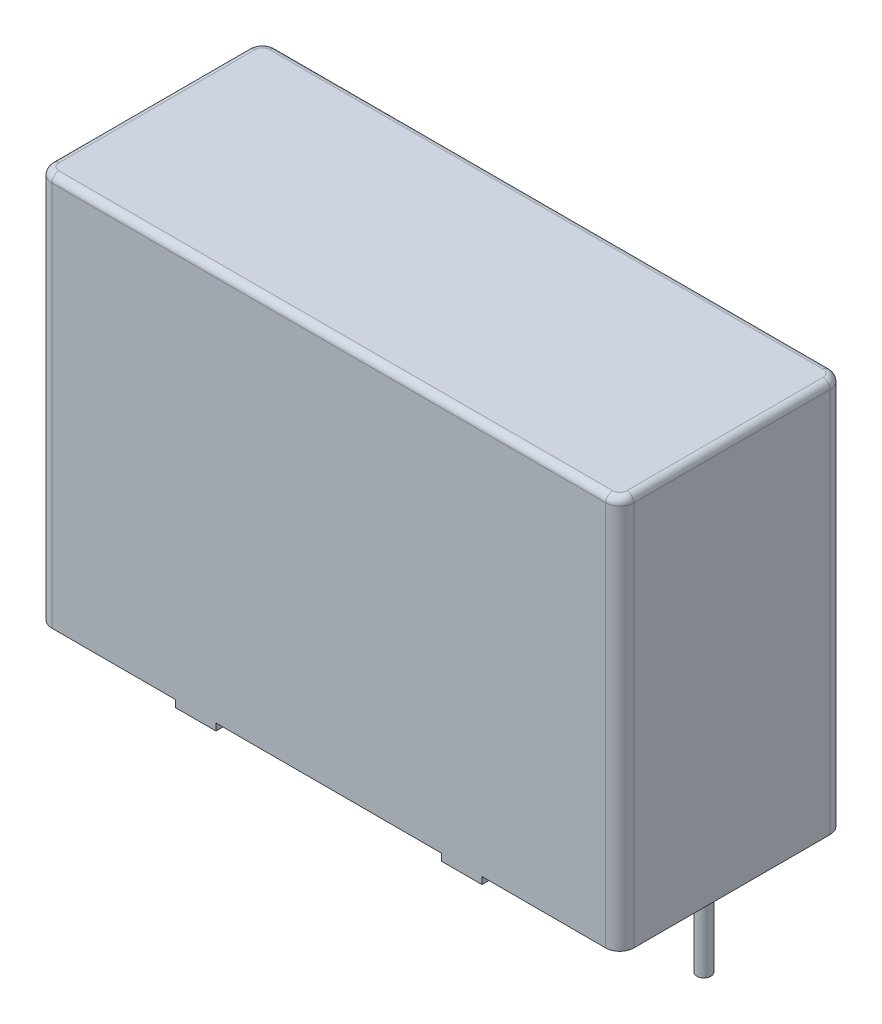
ISO-10303-21;
HEADER;
FILE_DESCRIPTION(('STEP AP214'),'2;1');
FILE_NAME('part.step','',(''),(''),'','','');
FILE_SCHEMA(('AUTOMOTIVE_DESIGN { 1 0 10303 214 1 1 1 1 }'));
ENDSEC;
DATA;
#1=APPLICATION_CONTEXT('core data for automotive mechanical design processes');
#2=APPLICATION_PROTOCOL_DEFINITION('international standard','automotive_design',2000,#1);
#3=PRODUCT_CONTEXT('',#1,'mechanical');
#4=PRODUCT('Part','Part','',(#3));
#5=PRODUCT_RELATED_PRODUCT_CATEGORY('part','',(#4));
#6=PRODUCT_DEFINITION_FORMATION('','',#4);
#7=PRODUCT_DEFINITION_CONTEXT('part definition',#1,'design');
#8=PRODUCT_DEFINITION('design','',#6,#7);
#9=PRODUCT_DEFINITION_SHAPE('','',#8);
#10=(LENGTH_UNIT() NAMED_UNIT(*) SI_UNIT(.MILLI.,.METRE.));
#11=(NAMED_UNIT(*) PLANE_ANGLE_UNIT() SI_UNIT($,.RADIAN.));
#12=(NAMED_UNIT(*) SI_UNIT($,.STERADIAN.) SOLID_ANGLE_UNIT());
#13=UNCERTAINTY_MEASURE_WITH_UNIT(LENGTH_MEASURE(1.E-05),#10,'distance_accuracy_value','');
#14=(GEOMETRIC_REPRESENTATION_CONTEXT(3) GLOBAL_UNCERTAINTY_ASSIGNED_CONTEXT((#13)) GLOBAL_UNIT_ASSIGNED_CONTEXT((#10,
#11,#12)) REPRESENTATION_CONTEXT('',''));
#15=CARTESIAN_POINT('',(0.,0.,0.));
#16=DIRECTION('',(0.,0.,1.));
#17=DIRECTION('',(1.,0.,0.));
#18=AXIS2_PLACEMENT_3D('',#15,#16,#17);
#19=CARTESIAN_POINT('',(20.75,28.5,8.));
#20=DIRECTION('',(-1.,0.,0.));
#21=DIRECTION('',(0.,0.,1.));
#22=AXIS2_PLACEMENT_3D('',#19,#20,#21);
#23=PLANE('',#22);
#24=DIRECTION('',(0.,0.,1.));
#25=VECTOR('',#24,1.);
#26=CARTESIAN_POINT('',(20.75,0.5,0.));
#27=LINE('',#26,#25);
#28=CARTESIAN_POINT('',(20.75,0.5,-7.));
#29=VERTEX_POINT('',#28);
#30=CARTESIAN_POINT('',(20.75,0.5,7.));
#31=VERTEX_POINT('',#30);
#32=EDGE_CURVE('E270',#29,#31,#27,.T.);
#33=ORIENTED_EDGE('',*,*,#32,.F.);
#34=DIRECTION('',(0.,-1.,0.));
#35=VECTOR('',#34,1.);
#36=CARTESIAN_POINT('',(20.75,28.5,-7.));
#37=LINE('',#36,#35);
#38=CARTESIAN_POINT('',(20.75,28.,-7.));
#39=VERTEX_POINT('',#38);
#40=EDGE_CURVE('E60',#29,#39,#37,.F.);
#41=ORIENTED_EDGE('',*,*,#40,.T.);
#42=DIRECTION('',(0.,0.,-1.));
#43=VECTOR('',#42,1.);
#44=CARTESIAN_POINT('',(20.75,28.,8.));
#45=LINE('',#44,#43);
#46=CARTESIAN_POINT('',(20.75,28.,7.));
#47=VERTEX_POINT('',#46);
#48=EDGE_CURVE('E11',#39,#47,#45,.F.);
#49=ORIENTED_EDGE('',*,*,#48,.T.);
#50=DIRECTION('',(0.,-1.,0.));
#51=VECTOR('',#50,1.);
#52=CARTESIAN_POINT('',(20.75,28.5,7.));
#53=LINE('',#52,#51);
#54=EDGE_CURVE('E375',#47,#31,#53,.T.);
#55=ORIENTED_EDGE('',*,*,#54,.T.);
#56=EDGE_LOOP('',(#33,#41,#49,#55));
#57=FACE_BOUND('',#56,.T.);
#58=ADVANCED_FACE('F36',(#57),#23,.F.);
#59=CARTESIAN_POINT('',(-20.75,28.5,-8.));
#60=DIRECTION('',(0.,0.,1.));
#61=DIRECTION('',(1.,0.,0.));
#62=AXIS2_PLACEMENT_3D('',#59,#60,#61);
#63=PLANE('',#62);
#64=DIRECTION('',(-1.,0.,0.));
#65=VECTOR('',#64,1.);
#66=CARTESIAN_POINT('',(-20.75,0.,-8.));
#67=LINE('',#66,#65);
#68=CARTESIAN_POINT('',(-8.05079654813872,0.,-8.));
#69=VERTEX_POINT('',#68);
#70=CARTESIAN_POINT('',(-10.9201115808664,0.,-8.));
#71=VERTEX_POINT('',#70);
#72=EDGE_CURVE('E362',#69,#71,#67,.T.);
#73=ORIENTED_EDGE('',*,*,#72,.T.);
#74=DIRECTION('',(0.,-1.,0.));
#75=VECTOR('',#74,1.);
#76=CARTESIAN_POINT('',(-10.9201115808664,0.5,-8.));
#77=LINE('',#76,#75);
#78=CARTESIAN_POINT('',(-10.9201115808664,0.5,-8.));
#79=VERTEX_POINT('',#78);
#80=EDGE_CURVE('E328',#79,#71,#77,.T.);
#81=ORIENTED_EDGE('',*,*,#80,.F.);
#82=DIRECTION('',(1.,0.,0.));
#83=VECTOR('',#82,1.);
#84=CARTESIAN_POINT('',(0.,0.5,-8.));
#85=LINE('',#84,#83);
#86=CARTESIAN_POINT('',(-19.75,0.5,-8.));
#87=VERTEX_POINT('',#86);
#88=EDGE_CURVE('E235',#87,#79,#85,.T.);
#89=ORIENTED_EDGE('',*,*,#88,.F.);
#90=DIRECTION('',(0.,-1.,0.));
#91=VECTOR('',#90,1.);
#92=CARTESIAN_POINT('',(-19.75,28.5,-8.));
#93=LINE('',#92,#91);
#94=CARTESIAN_POINT('',(-19.75,28.,-8.));
#95=VERTEX_POINT('',#94);
#96=EDGE_CURVE('E370',#87,#95,#93,.F.);
#97=ORIENTED_EDGE('',*,*,#96,.T.);
#98=DIRECTION('',(-1.,0.,0.));
#99=VECTOR('',#98,1.);
#100=CARTESIAN_POINT('',(-20.75,28.,-8.));
#101=LINE('',#100,#99);
#102=CARTESIAN_POINT('',(19.75,28.,-8.));
#103=VERTEX_POINT('',#102);
#104=EDGE_CURVE('E419',#95,#103,#101,.F.);
#105=ORIENTED_EDGE('',*,*,#104,.T.);
#106=DIRECTION('',(0.,-1.,0.));
#107=VECTOR('',#106,1.);
#108=CARTESIAN_POINT('',(19.75,28.5,-8.));
#109=LINE('',#108,#107);
#110=CARTESIAN_POINT('',(19.75,0.5,-8.));
#111=VERTEX_POINT('',#110);
#112=EDGE_CURVE('E372',#103,#111,#109,.T.);
#113=ORIENTED_EDGE('',*,*,#112,.T.);
#114=DIRECTION('',(1.,0.,0.));
#115=VECTOR('',#114,1.);
#116=CARTESIAN_POINT('',(0.,0.5,-8.));
#117=LINE('',#116,#115);
#118=CARTESIAN_POINT('',(10.9201115808664,0.5,-8.));
#119=VERTEX_POINT('',#118);
#120=EDGE_CURVE('E266',#119,#111,#117,.T.);
#121=ORIENTED_EDGE('',*,*,#120,.F.);
#122=DIRECTION('',(0.,-1.,0.));
#123=VECTOR('',#122,1.);
#124=CARTESIAN_POINT('',(10.9201115808664,0.5,-8.));
#125=LINE('',#124,#123);
#126=CARTESIAN_POINT('',(10.9201115808664,0.,-8.));
#127=VERTEX_POINT('',#126);
#128=EDGE_CURVE('E349',#119,#127,#125,.T.);
#129=ORIENTED_EDGE('',*,*,#128,.T.);
#130=CARTESIAN_POINT('',(8.05079654813871,0.,-8.));
#131=VERTEX_POINT('',#130);
#132=EDGE_CURVE('E365',#127,#131,#67,.T.);
#133=ORIENTED_EDGE('',*,*,#132,.T.);
#134=DIRECTION('',(0.,-1.,0.));
#135=VECTOR('',#134,1.);
#136=CARTESIAN_POINT('',(8.05079654813871,0.5,-8.));
#137=LINE('',#136,#135);
#138=CARTESIAN_POINT('',(8.05079654813871,0.5,-8.));
#139=VERTEX_POINT('',#138);
#140=EDGE_CURVE('E356',#139,#131,#137,.T.);
#141=ORIENTED_EDGE('',*,*,#140,.F.);
#142=DIRECTION('',(1.,0.,0.));
#143=VECTOR('',#142,1.);
#144=CARTESIAN_POINT('',(0.,0.5,-8.));
#145=LINE('',#144,#143);
#146=CARTESIAN_POINT('',(-8.05079654813872,0.5,-8.));
#147=VERTEX_POINT('',#146);
#148=EDGE_CURVE('E258',#147,#139,#145,.T.);
#149=ORIENTED_EDGE('',*,*,#148,.F.);
#150=DIRECTION('',(0.,-1.,0.));
#151=VECTOR('',#150,1.);
#152=CARTESIAN_POINT('',(-8.05079654813872,0.5,-8.));
#153=LINE('',#152,#151);
#154=EDGE_CURVE('E358',#147,#69,#153,.T.);
#155=ORIENTED_EDGE('',*,*,#154,.T.);
#156=EDGE_LOOP('',(#73,#81,#89,#97,#105,#113,#121,#129,#133,#141,#149,#155));
#157=FACE_BOUND('',#156,.T.);
#158=ADVANCED_FACE('F492',(#157),#63,.F.);
#159=CARTESIAN_POINT('',(-20.75,28.5,8.));
#160=DIRECTION('',(1.,0.,0.));
#161=DIRECTION('',(0.,0.,-1.));
#162=AXIS2_PLACEMENT_3D('',#159,#160,#161);
#163=PLANE('',#162);
#164=DIRECTION('',(0.,0.,-1.));
#165=VECTOR('',#164,1.);
#166=CARTESIAN_POINT('',(-20.75,0.5,0.));
#167=LINE('',#166,#165);
#168=CARTESIAN_POINT('',(-20.75,0.5,7.));
#169=VERTEX_POINT('',#168);
#170=CARTESIAN_POINT('',(-20.75,0.5,-7.));
#171=VERTEX_POINT('',#170);
#172=EDGE_CURVE('E297',#169,#171,#167,.T.);
#173=ORIENTED_EDGE('',*,*,#172,.F.);
#174=DIRECTION('',(0.,-1.,0.));
#175=VECTOR('',#174,1.);
#176=CARTESIAN_POINT('',(-20.75,28.5,7.));
#177=LINE('',#176,#175);
#178=CARTESIAN_POINT('',(-20.75,28.,7.));
#179=VERTEX_POINT('',#178);
#180=EDGE_CURVE('E384',#169,#179,#177,.F.);
#181=ORIENTED_EDGE('',*,*,#180,.T.);
#182=DIRECTION('',(0.,0.,1.));
#183=VECTOR('',#182,1.);
#184=CARTESIAN_POINT('',(-20.75,28.,8.));
#185=LINE('',#184,#183);
#186=CARTESIAN_POINT('',(-20.75,28.,-7.));
#187=VERTEX_POINT('',#186);
#188=EDGE_CURVE('E414',#179,#187,#185,.F.);
#189=ORIENTED_EDGE('',*,*,#188,.T.);
#190=DIRECTION('',(0.,-1.,0.));
#191=VECTOR('',#190,1.);
#192=CARTESIAN_POINT('',(-20.75,28.5,-7.));
#193=LINE('',#192,#191);
#194=EDGE_CURVE('E386',#187,#171,#193,.T.);
#195=ORIENTED_EDGE('',*,*,#194,.T.);
#196=EDGE_LOOP('',(#173,#181,#189,#195));
#197=FACE_BOUND('',#196,.T.);
#198=ADVANCED_FACE('F460',(#197),#163,.F.);
#199=CARTESIAN_POINT('',(-20.75,28.5,8.));
#200=DIRECTION('',(0.,0.,-1.));
#201=DIRECTION('',(-1.,0.,0.));
#202=AXIS2_PLACEMENT_3D('',#199,#200,#201);
#203=PLANE('',#202);
#204=DIRECTION('',(1.,0.,0.));
#205=VECTOR('',#204,1.);
#206=CARTESIAN_POINT('',(-20.75,0.,8.));
#207=LINE('',#206,#205);
#208=CARTESIAN_POINT('',(8.05079654813872,0.,8.));
#209=VERTEX_POINT('',#208);
#210=CARTESIAN_POINT('',(10.9201115808664,0.,8.));
#211=VERTEX_POINT('',#210);
#212=EDGE_CURVE('E366',#209,#211,#207,.T.);
#213=ORIENTED_EDGE('',*,*,#212,.T.);
#214=DIRECTION('',(0.,-1.,0.));
#215=VECTOR('',#214,1.);
#216=CARTESIAN_POINT('',(10.9201115808664,0.5,8.));
#217=LINE('',#216,#215);
#218=CARTESIAN_POINT('',(10.9201115808664,0.5,8.));
#219=VERTEX_POINT('',#218);
#220=EDGE_CURVE('E347',#219,#211,#217,.T.);
#221=ORIENTED_EDGE('',*,*,#220,.F.);
#222=DIRECTION('',(-1.,0.,0.));
#223=VECTOR('',#222,1.);
#224=CARTESIAN_POINT('',(0.,0.5,8.));
#225=LINE('',#224,#223);
#226=CARTESIAN_POINT('',(19.75,0.5,8.));
#227=VERTEX_POINT('',#226);
#228=EDGE_CURVE('E274',#227,#219,#225,.T.);
#229=ORIENTED_EDGE('',*,*,#228,.F.);
#230=DIRECTION('',(0.,-1.,0.));
#231=VECTOR('',#230,1.);
#232=CARTESIAN_POINT('',(19.75,28.5,8.));
#233=LINE('',#232,#231);
#234=CARTESIAN_POINT('',(19.75,28.,8.));
#235=VERTEX_POINT('',#234);
#236=EDGE_CURVE('E382',#227,#235,#233,.F.);
#237=ORIENTED_EDGE('',*,*,#236,.T.);
#238=DIRECTION('',(1.,0.,0.));
#239=VECTOR('',#238,1.);
#240=CARTESIAN_POINT('',(-20.75,28.,8.));
#241=LINE('',#240,#239);
#242=CARTESIAN_POINT('',(-19.75,28.,8.));
#243=VERTEX_POINT('',#242);
#244=EDGE_CURVE('E409',#235,#243,#241,.F.);
#245=ORIENTED_EDGE('',*,*,#244,.T.);
#246=DIRECTION('',(0.,-1.,0.));
#247=VECTOR('',#246,1.);
#248=CARTESIAN_POINT('',(-19.75,28.5,8.));
#249=LINE('',#248,#247);
#250=CARTESIAN_POINT('',(-19.75,0.5,8.));
#251=VERTEX_POINT('',#250);
#252=EDGE_CURVE('E379',#243,#251,#249,.T.);
#253=ORIENTED_EDGE('',*,*,#252,.T.);
#254=DIRECTION('',(-1.,0.,0.));
#255=VECTOR('',#254,1.);
#256=CARTESIAN_POINT('',(0.,0.5,8.));
#257=LINE('',#256,#255);
#258=CARTESIAN_POINT('',(-10.9201115808664,0.5,8.));
#259=VERTEX_POINT('',#258);
#260=EDGE_CURVE('E53',#259,#251,#257,.T.);
#261=ORIENTED_EDGE('',*,*,#260,.F.);
#262=DIRECTION('',(0.,-1.,0.));
#263=VECTOR('',#262,1.);
#264=CARTESIAN_POINT('',(-10.9201115808664,0.5,8.));
#265=LINE('',#264,#263);
#266=CARTESIAN_POINT('',(-10.9201115808664,0.,8.));
#267=VERTEX_POINT('',#266);
#268=EDGE_CURVE('E331',#259,#267,#265,.T.);
#269=ORIENTED_EDGE('',*,*,#268,.T.);
#270=CARTESIAN_POINT('',(-8.05079654813871,0.,8.));
#271=VERTEX_POINT('',#270);
#272=EDGE_CURVE('E369',#267,#271,#207,.T.);
#273=ORIENTED_EDGE('',*,*,#272,.T.);
#274=DIRECTION('',(0.,-1.,0.));
#275=VECTOR('',#274,1.);
#276=CARTESIAN_POINT('',(-8.05079654813871,0.5,8.));
#277=LINE('',#276,#275);
#278=CARTESIAN_POINT('',(-8.05079654813871,0.5,8.));
#279=VERTEX_POINT('',#278);
#280=EDGE_CURVE('E338',#279,#271,#277,.T.);
#281=ORIENTED_EDGE('',*,*,#280,.F.);
#282=DIRECTION('',(-1.,0.,0.));
#283=VECTOR('',#282,1.);
#284=CARTESIAN_POINT('',(0.,0.5,8.));
#285=LINE('',#284,#283);
#286=CARTESIAN_POINT('',(8.05079654813872,0.5,8.));
#287=VERTEX_POINT('',#286);
#288=EDGE_CURVE('E286',#287,#279,#285,.T.);
#289=ORIENTED_EDGE('',*,*,#288,.F.);
#290=DIRECTION('',(0.,-1.,0.));
#291=VECTOR('',#290,1.);
#292=CARTESIAN_POINT('',(8.05079654813872,0.5,8.));
#293=LINE('',#292,#291);
#294=EDGE_CURVE('E340',#287,#209,#293,.T.);
#295=ORIENTED_EDGE('',*,*,#294,.T.);
#296=EDGE_LOOP('',(#213,#221,#229,#237,#245,#253,#261,#269,#273,#281,#289,#295));
#297=FACE_BOUND('',#296,.T.);
#298=ADVANCED_FACE('F562',(#297),#203,.F.);
#299=CARTESIAN_POINT('',(0.,0.,0.));
#300=DIRECTION('',(0.,-1.,0.));
#301=DIRECTION('',(0.,0.,-1.));
#302=AXIS2_PLACEMENT_3D('',#299,#300,#301);
#303=PLANE('',#302);
#304=ORIENTED_EDGE('',*,*,#272,.F.);
#305=DIRECTION('',(0.,0.,-1.));
#306=VECTOR('',#305,1.);
#307=CARTESIAN_POINT('',(-10.9201115808663,0.,0.));
#308=LINE('',#307,#306);
#309=CARTESIAN_POINT('',(-10.9201115808664,0.,7.5));
#310=VERTEX_POINT('',#309);
#311=EDGE_CURVE('E248',#267,#310,#308,.T.);
#312=ORIENTED_EDGE('',*,*,#311,.T.);
#313=DIRECTION('',(-1.,0.,0.));
#314=VECTOR('',#313,1.);
#315=CARTESIAN_POINT('',(0.,0.,7.5));
#316=LINE('',#315,#314);
#317=CARTESIAN_POINT('',(-8.05079654813872,0.,7.5));
#318=VERTEX_POINT('',#317);
#319=EDGE_CURVE('E251',#318,#310,#316,.T.);
#320=ORIENTED_EDGE('',*,*,#319,.F.);
#321=DIRECTION('',(0.,0.,-1.));
#322=VECTOR('',#321,1.);
#323=CARTESIAN_POINT('',(-8.05079654813874,0.,0.));
#324=LINE('',#323,#322);
#325=EDGE_CURVE('E325',#271,#318,#324,.T.);
#326=ORIENTED_EDGE('',*,*,#325,.F.);
#327=EDGE_LOOP('',(#304,#312,#320,#326));
#328=FACE_BOUND('',#327,.T.);
#329=ADVANCED_FACE('F558',(#328),#303,.T.);
#330=ORIENTED_EDGE('',*,*,#212,.F.);
#331=DIRECTION('',(0.,0.,-1.));
#332=VECTOR('',#331,1.);
#333=CARTESIAN_POINT('',(8.05079654813874,0.,0.));
#334=LINE('',#333,#332);
#335=CARTESIAN_POINT('',(8.05079654813872,0.,7.5));
#336=VERTEX_POINT('',#335);
#337=EDGE_CURVE('E322',#209,#336,#334,.T.);
#338=ORIENTED_EDGE('',*,*,#337,.T.);
#339=CARTESIAN_POINT('',(10.9201115808664,0.,7.5));
#340=VERTEX_POINT('',#339);
#341=EDGE_CURVE('E319',#340,#336,#316,.T.);
#342=ORIENTED_EDGE('',*,*,#341,.F.);
#343=DIRECTION('',(0.,0.,-1.));
#344=VECTOR('',#343,1.);
#345=CARTESIAN_POINT('',(10.9201115808663,0.,0.));
#346=LINE('',#345,#344);
#347=EDGE_CURVE('E316',#211,#340,#346,.T.);
#348=ORIENTED_EDGE('',*,*,#347,.F.);
#349=EDGE_LOOP('',(#330,#338,#342,#348));
#350=FACE_BOUND('',#349,.T.);
#351=ADVANCED_FACE('F580',(#350),#303,.T.);
#352=ORIENTED_EDGE('',*,*,#132,.F.);
#353=DIRECTION('',(0.,0.,1.));
#354=VECTOR('',#353,1.);
#355=CARTESIAN_POINT('',(10.9201115808663,0.,0.));
#356=LINE('',#355,#354);
#357=CARTESIAN_POINT('',(10.9201115808664,0.,-7.5));
#358=VERTEX_POINT('',#357);
#359=EDGE_CURVE('E313',#127,#358,#356,.T.);
#360=ORIENTED_EDGE('',*,*,#359,.T.);
#361=DIRECTION('',(1.,0.,0.));
#362=VECTOR('',#361,1.);
#363=CARTESIAN_POINT('',(0.,0.,-7.5));
#364=LINE('',#363,#362);
#365=CARTESIAN_POINT('',(8.05079654813872,0.,-7.5));
#366=VERTEX_POINT('',#365);
#367=EDGE_CURVE('E307',#366,#358,#364,.T.);
#368=ORIENTED_EDGE('',*,*,#367,.F.);
#369=DIRECTION('',(0.,0.,1.));
#370=VECTOR('',#369,1.);
#371=CARTESIAN_POINT('',(8.05079654813874,0.,0.));
#372=LINE('',#371,#370);
#373=EDGE_CURVE('E310',#131,#366,#372,.T.);
#374=ORIENTED_EDGE('',*,*,#373,.F.);
#375=EDGE_LOOP('',(#352,#360,#368,#374));
#376=FACE_BOUND('',#375,.T.);
#377=ADVANCED_FACE('F544',(#376),#303,.T.);
#378=CARTESIAN_POINT('',(19.75,28.5,-7.));
#379=DIRECTION('',(0.,-1.,0.));
#380=DIRECTION('',(0.,0.,-1.));
#381=AXIS2_PLACEMENT_3D('',#378,#379,#380);
#382=CYLINDRICAL_SURFACE('',#381,1.);
#383=ORIENTED_EDGE('',*,*,#40,.F.);
#384=CARTESIAN_POINT('',(19.75,0.5,-7.));
#385=DIRECTION('',(0.,-1.,0.));
#386=DIRECTION('',(0.,0.,-1.));
#387=AXIS2_PLACEMENT_3D('',#384,#385,#386);
#388=CIRCLE('',#387,1.);
#389=EDGE_CURVE('E268',#111,#29,#388,.T.);
#390=ORIENTED_EDGE('',*,*,#389,.F.);
#391=ORIENTED_EDGE('',*,*,#112,.F.);
#392=CARTESIAN_POINT('',(19.75,28.,-7.));
#393=DIRECTION('',(0.,-1.,0.));
#394=DIRECTION('',(0.,0.,-1.));
#395=AXIS2_PLACEMENT_3D('',#392,#393,#394);
#396=CIRCLE('',#395,1.);
#397=EDGE_CURVE('E45',#103,#39,#396,.T.);
#398=ORIENTED_EDGE('',*,*,#397,.T.);
#399=EDGE_LOOP('',(#383,#390,#391,#398));
#400=FACE_BOUND('',#399,.T.);
#401=ADVANCED_FACE('F488',(#400),#382,.T.);
#402=CARTESIAN_POINT('',(19.75,28.5,7.));
#403=DIRECTION('',(0.,-1.,0.));
#404=DIRECTION('',(0.,0.,-1.));
#405=AXIS2_PLACEMENT_3D('',#402,#403,#404);
#406=CYLINDRICAL_SURFACE('',#405,1.);
#407=ORIENTED_EDGE('',*,*,#236,.F.);
#408=CARTESIAN_POINT('',(19.75,0.5,7.));
#409=DIRECTION('',(0.,-1.,0.));
#410=DIRECTION('',(0.,0.,-1.));
#411=AXIS2_PLACEMENT_3D('',#408,#409,#410);
#412=CIRCLE('',#411,1.);
#413=EDGE_CURVE('E272',#31,#227,#412,.T.);
#414=ORIENTED_EDGE('',*,*,#413,.F.);
#415=ORIENTED_EDGE('',*,*,#54,.F.);
#416=CARTESIAN_POINT('',(19.75,28.,7.));
#417=DIRECTION('',(0.,-1.,0.));
#418=DIRECTION('',(0.,0.,-1.));
#419=AXIS2_PLACEMENT_3D('',#416,#417,#418);
#420=CIRCLE('',#419,1.);
#421=EDGE_CURVE('E406',#47,#235,#420,.T.);
#422=ORIENTED_EDGE('',*,*,#421,.T.);
#423=EDGE_LOOP('',(#407,#414,#415,#422));
#424=FACE_BOUND('',#423,.T.);
#425=ADVANCED_FACE('F519',(#424),#406,.T.);
#426=CARTESIAN_POINT('',(-19.75,28.5,-7.));
#427=DIRECTION('',(0.,-1.,0.));
#428=DIRECTION('',(0.,0.,-1.));
#429=AXIS2_PLACEMENT_3D('',#426,#427,#428);
#430=CYLINDRICAL_SURFACE('',#429,1.);
#431=ORIENTED_EDGE('',*,*,#96,.F.);
#432=CARTESIAN_POINT('',(-19.75,0.5,-7.));
#433=DIRECTION('',(0.,-1.,0.));
#434=DIRECTION('',(0.,0.,-1.));
#435=AXIS2_PLACEMENT_3D('',#432,#433,#434);
#436=CIRCLE('',#435,1.);
#437=EDGE_CURVE('E299',#171,#87,#436,.T.);
#438=ORIENTED_EDGE('',*,*,#437,.F.);
#439=ORIENTED_EDGE('',*,*,#194,.F.);
#440=CARTESIAN_POINT('',(-19.75,28.,-7.));
#441=DIRECTION('',(0.,-1.,0.));
#442=DIRECTION('',(0.,0.,-1.));
#443=AXIS2_PLACEMENT_3D('',#440,#441,#442);
#444=CIRCLE('',#443,1.);
#445=EDGE_CURVE('E416',#187,#95,#444,.T.);
#446=ORIENTED_EDGE('',*,*,#445,.T.);
#447=EDGE_LOOP('',(#431,#438,#439,#446));
#448=FACE_BOUND('',#447,.T.);
#449=ADVANCED_FACE('F456',(#448),#430,.T.);
#450=CARTESIAN_POINT('',(-19.75,28.5,7.));
#451=DIRECTION('',(0.,-1.,0.));
#452=DIRECTION('',(0.,0.,-1.));
#453=AXIS2_PLACEMENT_3D('',#450,#451,#452);
#454=CYLINDRICAL_SURFACE('',#453,1.);
#455=ORIENTED_EDGE('',*,*,#180,.F.);
#456=CARTESIAN_POINT('',(-19.75,0.5,7.));
#457=DIRECTION('',(0.,-1.,0.));
#458=DIRECTION('',(0.,0.,-1.));
#459=AXIS2_PLACEMENT_3D('',#456,#457,#458);
#460=CIRCLE('',#459,1.);
#461=EDGE_CURVE('E295',#251,#169,#460,.T.);
#462=ORIENTED_EDGE('',*,*,#461,.F.);
#463=ORIENTED_EDGE('',*,*,#252,.F.);
#464=CARTESIAN_POINT('',(-19.75,28.,7.));
#465=DIRECTION('',(0.,-1.,0.));
#466=DIRECTION('',(0.,0.,-1.));
#467=AXIS2_PLACEMENT_3D('',#464,#465,#466);
#468=CIRCLE('',#467,1.);
#469=EDGE_CURVE('E411',#243,#179,#468,.T.);
#470=ORIENTED_EDGE('',*,*,#469,.T.);
#471=EDGE_LOOP('',(#455,#462,#463,#470));
#472=FACE_BOUND('',#471,.T.);
#473=ADVANCED_FACE('F465',(#472),#454,.T.);
#474=CARTESIAN_POINT('',(0.,28.5,0.));
#475=DIRECTION('',(0.,-1.,0.));
#476=DIRECTION('',(0.,0.,-1.));
#477=AXIS2_PLACEMENT_3D('',#474,#475,#476);
#478=PLANE('',#477);
#479=DIRECTION('',(1.,0.,0.));
#480=VECTOR('',#479,1.);
#481=CARTESIAN_POINT('',(0.,28.5,7.5));
#482=LINE('',#481,#480);
#483=CARTESIAN_POINT('',(-19.75,28.5,7.5));
#484=VERTEX_POINT('',#483);
#485=CARTESIAN_POINT('',(19.75,28.5,7.5));
#486=VERTEX_POINT('',#485);
#487=EDGE_CURVE('E401',#484,#486,#482,.T.);
#488=ORIENTED_EDGE('',*,*,#487,.T.);
#489=CARTESIAN_POINT('',(19.75,28.5,7.));
#490=DIRECTION('',(0.,-1.,0.));
#491=DIRECTION('',(0.,0.,-1.));
#492=AXIS2_PLACEMENT_3D('',#489,#490,#491);
#493=CIRCLE('',#492,0.5);
#494=CARTESIAN_POINT('',(20.25,28.5,7.));
#495=VERTEX_POINT('',#494);
#496=EDGE_CURVE('E403',#486,#495,#493,.F.);
#497=ORIENTED_EDGE('',*,*,#496,.T.);
#498=DIRECTION('',(0.,0.,-1.));
#499=VECTOR('',#498,1.);
#500=CARTESIAN_POINT('',(20.25,28.5,0.));
#501=LINE('',#500,#499);
#502=CARTESIAN_POINT('',(20.25,28.5,-7.));
#503=VERTEX_POINT('',#502);
#504=EDGE_CURVE('E389',#495,#503,#501,.T.);
#505=ORIENTED_EDGE('',*,*,#504,.T.);
#506=CARTESIAN_POINT('',(19.75,28.5,-7.));
#507=DIRECTION('',(0.,-1.,0.));
#508=DIRECTION('',(0.,0.,-1.));
#509=AXIS2_PLACEMENT_3D('',#506,#507,#508);
#510=CIRCLE('',#509,0.5);
#511=CARTESIAN_POINT('',(19.75,28.5,-7.5));
#512=VERTEX_POINT('',#511);
#513=EDGE_CURVE('E391',#503,#512,#510,.F.);
#514=ORIENTED_EDGE('',*,*,#513,.T.);
#515=DIRECTION('',(-1.,0.,0.));
#516=VECTOR('',#515,1.);
#517=CARTESIAN_POINT('',(0.,28.5,-7.5));
#518=LINE('',#517,#516);
#519=CARTESIAN_POINT('',(-19.75,28.5,-7.5));
#520=VERTEX_POINT('',#519);
#521=EDGE_CURVE('E393',#512,#520,#518,.T.);
#522=ORIENTED_EDGE('',*,*,#521,.T.);
#523=CARTESIAN_POINT('',(-19.75,28.5,-7.));
#524=DIRECTION('',(0.,-1.,0.));
#525=DIRECTION('',(0.,0.,-1.));
#526=AXIS2_PLACEMENT_3D('',#523,#524,#525);
#527=CIRCLE('',#526,0.5);
#528=CARTESIAN_POINT('',(-20.25,28.5,-7.));
#529=VERTEX_POINT('',#528);
#530=EDGE_CURVE('E395',#520,#529,#527,.F.);
#531=ORIENTED_EDGE('',*,*,#530,.T.);
#532=DIRECTION('',(0.,0.,1.));
#533=VECTOR('',#532,1.);
#534=CARTESIAN_POINT('',(-20.25,28.5,0.));
#535=LINE('',#534,#533);
#536=CARTESIAN_POINT('',(-20.25,28.5,7.));
#537=VERTEX_POINT('',#536);
#538=EDGE_CURVE('E397',#529,#537,#535,.T.);
#539=ORIENTED_EDGE('',*,*,#538,.T.);
#540=CARTESIAN_POINT('',(-19.75,28.5,7.));
#541=DIRECTION('',(0.,-1.,0.));
#542=DIRECTION('',(0.,0.,-1.));
#543=AXIS2_PLACEMENT_3D('',#540,#541,#542);
#544=CIRCLE('',#543,0.5);
#545=EDGE_CURVE('E399',#537,#484,#544,.F.);
#546=ORIENTED_EDGE('',*,*,#545,.T.);
#547=EDGE_LOOP('',(#488,#497,#505,#514,#522,#531,#539,#546));
#548=FACE_BOUND('',#547,.T.);
#549=ADVANCED_FACE('F477',(#548),#478,.F.);
#550=DIRECTION('',(0.,0.,1.));
#551=VECTOR('',#550,1.);
#552=CARTESIAN_POINT('',(-10.9201115808663,0.,0.));
#553=LINE('',#552,#551);
#554=CARTESIAN_POINT('',(-10.9201115808664,0.,-7.5));
#555=VERTEX_POINT('',#554);
#556=EDGE_CURVE('E230',#71,#555,#553,.T.);
#557=ORIENTED_EDGE('',*,*,#556,.F.);
#558=ORIENTED_EDGE('',*,*,#72,.F.);
#559=DIRECTION('',(0.,0.,1.));
#560=VECTOR('',#559,1.);
#561=CARTESIAN_POINT('',(-8.05079654813874,0.,0.));
#562=LINE('',#561,#560);
#563=CARTESIAN_POINT('',(-8.05079654813872,0.,-7.5));
#564=VERTEX_POINT('',#563);
#565=EDGE_CURVE('E306',#69,#564,#562,.T.);
#566=ORIENTED_EDGE('',*,*,#565,.T.);
#567=EDGE_CURVE('E303',#555,#564,#364,.T.);
#568=ORIENTED_EDGE('',*,*,#567,.F.);
#569=EDGE_LOOP('',(#557,#558,#566,#568));
#570=FACE_BOUND('',#569,.T.);
#571=ADVANCED_FACE('F495',(#570),#303,.T.);
#572=CARTESIAN_POINT('',(-19.75,28.,-7.));
#573=DIRECTION('',(0.,-1.,0.));
#574=DIRECTION('',(0.,0.,-1.));
#575=AXIS2_PLACEMENT_3D('',#572,#573,#574);
#576=DEGENERATE_TOROIDAL_SURFACE('',#575,0.5,0.5,.T.);
#577=CARTESIAN_POINT('',(-19.75,28.,-7.5));
#578=DIRECTION('',(1.,0.,0.));
#579=DIRECTION('',(0.,0.,-1.));
#580=AXIS2_PLACEMENT_3D('',#577,#578,#579);
#581=CIRCLE('',#580,0.5);
#582=EDGE_CURVE('E437',#95,#520,#581,.T.);
#583=ORIENTED_EDGE('',*,*,#582,.F.);
#584=ORIENTED_EDGE('',*,*,#445,.F.);
#585=CARTESIAN_POINT('',(-20.25,28.,-7.));
#586=DIRECTION('',(0.,0.,1.));
#587=DIRECTION('',(1.,0.,0.));
#588=AXIS2_PLACEMENT_3D('',#585,#586,#587);
#589=CIRCLE('',#588,0.5);
#590=EDGE_CURVE('E40',#529,#187,#589,.T.);
#591=ORIENTED_EDGE('',*,*,#590,.F.);
#592=ORIENTED_EDGE('',*,*,#530,.F.);
#593=EDGE_LOOP('',(#583,#584,#591,#592));
#594=FACE_BOUND('',#593,.T.);
#595=ADVANCED_FACE('F38',(#594),#576,.T.);
#596=CARTESIAN_POINT('',(-20.25,28.,0.));
#597=DIRECTION('',(0.,0.,1.));
#598=DIRECTION('',(1.,0.,0.));
#599=AXIS2_PLACEMENT_3D('',#596,#597,#598);
#600=CYLINDRICAL_SURFACE('',#599,0.5);
#601=ORIENTED_EDGE('',*,*,#590,.T.);
#602=ORIENTED_EDGE('',*,*,#188,.F.);
#603=CARTESIAN_POINT('',(-20.25,28.,7.));
#604=DIRECTION('',(0.,0.,1.));
#605=DIRECTION('',(1.,0.,0.));
#606=AXIS2_PLACEMENT_3D('',#603,#604,#605);
#607=CIRCLE('',#606,0.5);
#608=EDGE_CURVE('E435',#537,#179,#607,.T.);
#609=ORIENTED_EDGE('',*,*,#608,.F.);
#610=ORIENTED_EDGE('',*,*,#538,.F.);
#611=EDGE_LOOP('',(#601,#602,#609,#610));
#612=FACE_BOUND('',#611,.T.);
#613=ADVANCED_FACE('F448',(#612),#600,.T.);
#614=CARTESIAN_POINT('',(0.,28.,-7.5));
#615=DIRECTION('',(-1.,0.,0.));
#616=DIRECTION('',(0.,0.,1.));
#617=AXIS2_PLACEMENT_3D('',#614,#615,#616);
#618=CYLINDRICAL_SURFACE('',#617,0.5);
#619=ORIENTED_EDGE('',*,*,#582,.T.);
#620=ORIENTED_EDGE('',*,*,#521,.F.);
#621=CARTESIAN_POINT('',(19.75,28.,-7.5));
#622=DIRECTION('',(1.,0.,0.));
#623=DIRECTION('',(0.,0.,-1.));
#624=AXIS2_PLACEMENT_3D('',#621,#622,#623);
#625=CIRCLE('',#624,0.5);
#626=EDGE_CURVE('E432',#103,#512,#625,.T.);
#627=ORIENTED_EDGE('',*,*,#626,.F.);
#628=ORIENTED_EDGE('',*,*,#104,.F.);
#629=EDGE_LOOP('',(#619,#620,#627,#628));
#630=FACE_BOUND('',#629,.T.);
#631=ADVANCED_FACE('F480',(#630),#618,.T.);
#632=CARTESIAN_POINT('',(-19.75,28.,7.));
#633=DIRECTION('',(0.,-1.,0.));
#634=DIRECTION('',(0.,0.,-1.));
#635=AXIS2_PLACEMENT_3D('',#632,#633,#634);
#636=DEGENERATE_TOROIDAL_SURFACE('',#635,0.5,0.5,.T.);
#637=ORIENTED_EDGE('',*,*,#608,.T.);
#638=ORIENTED_EDGE('',*,*,#469,.F.);
#639=CARTESIAN_POINT('',(-19.75,28.,7.5));
#640=DIRECTION('',(1.,0.,0.));
#641=DIRECTION('',(0.,0.,-1.));
#642=AXIS2_PLACEMENT_3D('',#639,#640,#641);
#643=CIRCLE('',#642,0.5);
#644=EDGE_CURVE('E429',#484,#243,#643,.T.);
#645=ORIENTED_EDGE('',*,*,#644,.F.);
#646=ORIENTED_EDGE('',*,*,#545,.F.);
#647=EDGE_LOOP('',(#637,#638,#645,#646));
#648=FACE_BOUND('',#647,.T.);
#649=ADVANCED_FACE('F468',(#648),#636,.T.);
#650=CARTESIAN_POINT('',(19.75,28.,-7.));
#651=DIRECTION('',(0.,-1.,0.));
#652=DIRECTION('',(0.,0.,-1.));
#653=AXIS2_PLACEMENT_3D('',#650,#651,#652);
#654=DEGENERATE_TOROIDAL_SURFACE('',#653,0.5,0.5,.T.);
#655=ORIENTED_EDGE('',*,*,#626,.T.);
#656=ORIENTED_EDGE('',*,*,#513,.F.);
#657=CARTESIAN_POINT('',(20.25,28.,-7.));
#658=DIRECTION('',(0.,0.,1.));
#659=DIRECTION('',(1.,0.,0.));
#660=AXIS2_PLACEMENT_3D('',#657,#658,#659);
#661=CIRCLE('',#660,0.5);
#662=EDGE_CURVE('E426',#39,#503,#661,.T.);
#663=ORIENTED_EDGE('',*,*,#662,.F.);
#664=ORIENTED_EDGE('',*,*,#397,.F.);
#665=EDGE_LOOP('',(#655,#656,#663,#664));
#666=FACE_BOUND('',#665,.T.);
#667=ADVANCED_FACE('F483',(#666),#654,.T.);
#668=CARTESIAN_POINT('',(0.,28.,7.5));
#669=DIRECTION('',(1.,0.,0.));
#670=DIRECTION('',(0.,0.,-1.));
#671=AXIS2_PLACEMENT_3D('',#668,#669,#670);
#672=CYLINDRICAL_SURFACE('',#671,0.5);
#673=ORIENTED_EDGE('',*,*,#644,.T.);
#674=ORIENTED_EDGE('',*,*,#244,.F.);
#675=CARTESIAN_POINT('',(19.75,28.,7.5));
#676=DIRECTION('',(1.,0.,0.));
#677=DIRECTION('',(0.,0.,-1.));
#678=AXIS2_PLACEMENT_3D('',#675,#676,#677);
#679=CIRCLE('',#678,0.5);
#680=EDGE_CURVE('E423',#486,#235,#679,.T.);
#681=ORIENTED_EDGE('',*,*,#680,.F.);
#682=ORIENTED_EDGE('',*,*,#487,.F.);
#683=EDGE_LOOP('',(#673,#674,#681,#682));
#684=FACE_BOUND('',#683,.T.);
#685=ADVANCED_FACE('F473',(#684),#672,.T.);
#686=CARTESIAN_POINT('',(20.25,28.,0.));
#687=DIRECTION('',(0.,0.,-1.));
#688=DIRECTION('',(-1.,0.,0.));
#689=AXIS2_PLACEMENT_3D('',#686,#687,#688);
#690=CYLINDRICAL_SURFACE('',#689,0.5);
#691=ORIENTED_EDGE('',*,*,#662,.T.);
#692=ORIENTED_EDGE('',*,*,#504,.F.);
#693=CARTESIAN_POINT('',(20.25,28.,7.));
#694=DIRECTION('',(0.,0.,1.));
#695=DIRECTION('',(1.,0.,0.));
#696=AXIS2_PLACEMENT_3D('',#693,#694,#695);
#697=CIRCLE('',#696,0.5);
#698=EDGE_CURVE('E330',#47,#495,#697,.T.);
#699=ORIENTED_EDGE('',*,*,#698,.F.);
#700=ORIENTED_EDGE('',*,*,#48,.F.);
#701=EDGE_LOOP('',(#691,#692,#699,#700));
#702=FACE_BOUND('',#701,.T.);
#703=ADVANCED_FACE('F525',(#702),#690,.T.);
#704=CARTESIAN_POINT('',(19.75,28.,7.));
#705=DIRECTION('',(0.,-1.,0.));
#706=DIRECTION('',(0.,0.,-1.));
#707=AXIS2_PLACEMENT_3D('',#704,#705,#706);
#708=DEGENERATE_TOROIDAL_SURFACE('',#707,0.5,0.5,.T.);
#709=ORIENTED_EDGE('',*,*,#680,.T.);
#710=ORIENTED_EDGE('',*,*,#421,.F.);
#711=ORIENTED_EDGE('',*,*,#698,.T.);
#712=ORIENTED_EDGE('',*,*,#496,.F.);
#713=EDGE_LOOP('',(#709,#710,#711,#712));
#714=FACE_BOUND('',#713,.T.);
#715=ADVANCED_FACE('F522',(#714),#708,.T.);
#716=CARTESIAN_POINT('',(-10.9201115808663,0.5,0.));
#717=DIRECTION('',(1.,0.,0.));
#718=DIRECTION('',(0.,0.,-1.));
#719=AXIS2_PLACEMENT_3D('',#716,#717,#718);
#720=PLANE('',#719);
#721=ORIENTED_EDGE('',*,*,#556,.T.);
#722=DIRECTION('',(0.,-1.,0.));
#723=VECTOR('',#722,1.);
#724=CARTESIAN_POINT('',(-10.9201115808664,0.5,-7.5));
#725=LINE('',#724,#723);
#726=CARTESIAN_POINT('',(-10.9201115808664,0.5,-7.5));
#727=VERTEX_POINT('',#726);
#728=EDGE_CURVE('E223',#727,#555,#725,.T.);
#729=ORIENTED_EDGE('',*,*,#728,.F.);
#730=DIRECTION('',(0.,0.,1.));
#731=VECTOR('',#730,1.);
#732=CARTESIAN_POINT('',(-10.9201115808663,0.5,0.));
#733=LINE('',#732,#731);
#734=EDGE_CURVE('E227',#79,#727,#733,.T.);
#735=ORIENTED_EDGE('',*,*,#734,.F.);
#736=ORIENTED_EDGE('',*,*,#80,.T.);
#737=EDGE_LOOP('',(#721,#729,#735,#736));
#738=FACE_BOUND('',#737,.T.);
#739=ADVANCED_FACE('F225',(#738),#720,.F.);
#740=CARTESIAN_POINT('',(-10.9201115808663,0.5,0.));
#741=DIRECTION('',(-1.,0.,0.));
#742=DIRECTION('',(0.,0.,1.));
#743=AXIS2_PLACEMENT_3D('',#740,#741,#742);
#744=PLANE('',#743);
#745=ORIENTED_EDGE('',*,*,#311,.F.);
#746=ORIENTED_EDGE('',*,*,#268,.F.);
#747=DIRECTION('',(0.,0.,-1.));
#748=VECTOR('',#747,1.);
#749=CARTESIAN_POINT('',(-10.9201115808663,0.5,0.));
#750=LINE('',#749,#748);
#751=CARTESIAN_POINT('',(-10.9201115808664,0.5,7.5));
#752=VERTEX_POINT('',#751);
#753=EDGE_CURVE('E292',#259,#752,#750,.T.);
#754=ORIENTED_EDGE('',*,*,#753,.T.);
#755=DIRECTION('',(0.,-1.,0.));
#756=VECTOR('',#755,1.);
#757=CARTESIAN_POINT('',(-10.9201115808664,0.5,7.5));
#758=LINE('',#757,#756);
#759=EDGE_CURVE('E334',#752,#310,#758,.T.);
#760=ORIENTED_EDGE('',*,*,#759,.T.);
#761=EDGE_LOOP('',(#745,#746,#754,#760));
#762=FACE_BOUND('',#761,.T.);
#763=ADVANCED_FACE('F628',(#762),#744,.T.);
#764=CARTESIAN_POINT('',(0.,0.5,7.5));
#765=DIRECTION('',(0.,0.,1.));
#766=DIRECTION('',(1.,0.,0.));
#767=AXIS2_PLACEMENT_3D('',#764,#765,#766);
#768=PLANE('',#767);
#769=ORIENTED_EDGE('',*,*,#319,.T.);
#770=ORIENTED_EDGE('',*,*,#759,.F.);
#771=DIRECTION('',(-1.,0.,0.));
#772=VECTOR('',#771,1.);
#773=CARTESIAN_POINT('',(0.,0.5,7.5));
#774=LINE('',#773,#772);
#775=CARTESIAN_POINT('',(-8.05079654813872,0.5,7.5));
#776=VERTEX_POINT('',#775);
#777=EDGE_CURVE('E284',#776,#752,#774,.T.);
#778=ORIENTED_EDGE('',*,*,#777,.F.);
#779=DIRECTION('',(0.,-1.,0.));
#780=VECTOR('',#779,1.);
#781=CARTESIAN_POINT('',(-8.05079654813872,0.5,7.5));
#782=LINE('',#781,#780);
#783=EDGE_CURVE('E336',#776,#318,#782,.T.);
#784=ORIENTED_EDGE('',*,*,#783,.T.);
#785=EDGE_LOOP('',(#769,#770,#778,#784));
#786=FACE_BOUND('',#785,.T.);
#787=ADVANCED_FACE('F637',(#786),#768,.F.);
#788=CARTESIAN_POINT('',(-8.05079654813874,0.5,0.));
#789=DIRECTION('',(-1.,0.,0.));
#790=DIRECTION('',(0.,0.,1.));
#791=AXIS2_PLACEMENT_3D('',#788,#789,#790);
#792=PLANE('',#791);
#793=ORIENTED_EDGE('',*,*,#325,.T.);
#794=ORIENTED_EDGE('',*,*,#783,.F.);
#795=DIRECTION('',(0.,0.,-1.));
#796=VECTOR('',#795,1.);
#797=CARTESIAN_POINT('',(-8.05079654813874,0.5,0.));
#798=LINE('',#797,#796);
#799=EDGE_CURVE('E289',#279,#776,#798,.T.);
#800=ORIENTED_EDGE('',*,*,#799,.F.);
#801=ORIENTED_EDGE('',*,*,#280,.T.);
#802=EDGE_LOOP('',(#793,#794,#800,#801));
#803=FACE_BOUND('',#802,.T.);
#804=ADVANCED_FACE('F648',(#803),#792,.F.);
#805=CARTESIAN_POINT('',(8.05079654813874,0.5,0.));
#806=DIRECTION('',(-1.,0.,0.));
#807=DIRECTION('',(0.,0.,1.));
#808=AXIS2_PLACEMENT_3D('',#805,#806,#807);
#809=PLANE('',#808);
#810=ORIENTED_EDGE('',*,*,#337,.F.);
#811=ORIENTED_EDGE('',*,*,#294,.F.);
#812=DIRECTION('',(0.,0.,-1.));
#813=VECTOR('',#812,1.);
#814=CARTESIAN_POINT('',(8.05079654813874,0.5,0.));
#815=LINE('',#814,#813);
#816=CARTESIAN_POINT('',(8.05079654813872,0.5,7.5));
#817=VERTEX_POINT('',#816);
#818=EDGE_CURVE('E283',#287,#817,#815,.T.);
#819=ORIENTED_EDGE('',*,*,#818,.T.);
#820=DIRECTION('',(0.,-1.,0.));
#821=VECTOR('',#820,1.);
#822=CARTESIAN_POINT('',(8.05079654813872,0.5,7.5));
#823=LINE('',#822,#821);
#824=EDGE_CURVE('E343',#817,#336,#823,.T.);
#825=ORIENTED_EDGE('',*,*,#824,.T.);
#826=EDGE_LOOP('',(#810,#811,#819,#825));
#827=FACE_BOUND('',#826,.T.);
#828=ADVANCED_FACE('F660',(#827),#809,.T.);
#829=ORIENTED_EDGE('',*,*,#341,.T.);
#830=ORIENTED_EDGE('',*,*,#824,.F.);
#831=CARTESIAN_POINT('',(10.9201115808664,0.5,7.5));
#832=VERTEX_POINT('',#831);
#833=EDGE_CURVE('E280',#832,#817,#774,.T.);
#834=ORIENTED_EDGE('',*,*,#833,.F.);
#835=DIRECTION('',(0.,-1.,0.));
#836=VECTOR('',#835,1.);
#837=CARTESIAN_POINT('',(10.9201115808664,0.5,7.5));
#838=LINE('',#837,#836);
#839=EDGE_CURVE('E345',#832,#340,#838,.T.);
#840=ORIENTED_EDGE('',*,*,#839,.T.);
#841=EDGE_LOOP('',(#829,#830,#834,#840));
#842=FACE_BOUND('',#841,.T.);
#843=ADVANCED_FACE('F651',(#842),#768,.F.);
#844=CARTESIAN_POINT('',(10.9201115808663,0.5,0.));
#845=DIRECTION('',(-1.,0.,0.));
#846=DIRECTION('',(0.,0.,1.));
#847=AXIS2_PLACEMENT_3D('',#844,#845,#846);
#848=PLANE('',#847);
#849=ORIENTED_EDGE('',*,*,#347,.T.);
#850=ORIENTED_EDGE('',*,*,#839,.F.);
#851=DIRECTION('',(0.,0.,-1.));
#852=VECTOR('',#851,1.);
#853=CARTESIAN_POINT('',(10.9201115808663,0.5,0.));
#854=LINE('',#853,#852);
#855=EDGE_CURVE('E277',#219,#832,#854,.T.);
#856=ORIENTED_EDGE('',*,*,#855,.F.);
#857=ORIENTED_EDGE('',*,*,#220,.T.);
#858=EDGE_LOOP('',(#849,#850,#856,#857));
#859=FACE_BOUND('',#858,.T.);
#860=ADVANCED_FACE('F680',(#859),#848,.F.);
#861=CARTESIAN_POINT('',(10.9201115808663,0.5,0.));
#862=DIRECTION('',(1.,0.,0.));
#863=DIRECTION('',(0.,0.,-1.));
#864=AXIS2_PLACEMENT_3D('',#861,#862,#863);
#865=PLANE('',#864);
#866=ORIENTED_EDGE('',*,*,#359,.F.);
#867=ORIENTED_EDGE('',*,*,#128,.F.);
#868=DIRECTION('',(0.,0.,1.));
#869=VECTOR('',#868,1.);
#870=CARTESIAN_POINT('',(10.9201115808663,0.5,0.));
#871=LINE('',#870,#869);
#872=CARTESIAN_POINT('',(10.9201115808664,0.5,-7.5));
#873=VERTEX_POINT('',#872);
#874=EDGE_CURVE('E264',#119,#873,#871,.T.);
#875=ORIENTED_EDGE('',*,*,#874,.T.);
#876=DIRECTION('',(0.,-1.,0.));
#877=VECTOR('',#876,1.);
#878=CARTESIAN_POINT('',(10.9201115808664,0.5,-7.5));
#879=LINE('',#878,#877);
#880=EDGE_CURVE('E352',#873,#358,#879,.T.);
#881=ORIENTED_EDGE('',*,*,#880,.T.);
#882=EDGE_LOOP('',(#866,#867,#875,#881));
#883=FACE_BOUND('',#882,.T.);
#884=ADVANCED_FACE('F513',(#883),#865,.T.);
#885=CARTESIAN_POINT('',(0.,0.5,-7.5));
#886=DIRECTION('',(0.,0.,-1.));
#887=DIRECTION('',(-1.,0.,0.));
#888=AXIS2_PLACEMENT_3D('',#885,#886,#887);
#889=PLANE('',#888);
#890=ORIENTED_EDGE('',*,*,#367,.T.);
#891=ORIENTED_EDGE('',*,*,#880,.F.);
#892=DIRECTION('',(1.,0.,0.));
#893=VECTOR('',#892,1.);
#894=CARTESIAN_POINT('',(0.,0.5,-7.5));
#895=LINE('',#894,#893);
#896=CARTESIAN_POINT('',(8.05079654813872,0.5,-7.5));
#897=VERTEX_POINT('',#896);
#898=EDGE_CURVE('E244',#897,#873,#895,.T.);
#899=ORIENTED_EDGE('',*,*,#898,.F.);
#900=DIRECTION('',(0.,-1.,0.));
#901=VECTOR('',#900,1.);
#902=CARTESIAN_POINT('',(8.05079654813872,0.5,-7.5));
#903=LINE('',#902,#901);
#904=EDGE_CURVE('E354',#897,#366,#903,.T.);
#905=ORIENTED_EDGE('',*,*,#904,.T.);
#906=EDGE_LOOP('',(#890,#891,#899,#905));
#907=FACE_BOUND('',#906,.T.);
#908=ADVANCED_FACE('F511',(#907),#889,.F.);
#909=CARTESIAN_POINT('',(8.05079654813874,0.5,0.));
#910=DIRECTION('',(1.,0.,0.));
#911=DIRECTION('',(0.,0.,-1.));
#912=AXIS2_PLACEMENT_3D('',#909,#910,#911);
#913=PLANE('',#912);
#914=ORIENTED_EDGE('',*,*,#373,.T.);
#915=ORIENTED_EDGE('',*,*,#904,.F.);
#916=DIRECTION('',(0.,0.,1.));
#917=VECTOR('',#916,1.);
#918=CARTESIAN_POINT('',(8.05079654813874,0.5,0.));
#919=LINE('',#918,#917);
#920=EDGE_CURVE('E261',#139,#897,#919,.T.);
#921=ORIENTED_EDGE('',*,*,#920,.F.);
#922=ORIENTED_EDGE('',*,*,#140,.T.);
#923=EDGE_LOOP('',(#914,#915,#921,#922));
#924=FACE_BOUND('',#923,.T.);
#925=ADVANCED_FACE('F505',(#924),#913,.F.);
#926=CARTESIAN_POINT('',(-8.05079654813874,0.5,0.));
#927=DIRECTION('',(1.,0.,0.));
#928=DIRECTION('',(0.,0.,-1.));
#929=AXIS2_PLACEMENT_3D('',#926,#927,#928);
#930=PLANE('',#929);
#931=ORIENTED_EDGE('',*,*,#565,.F.);
#932=ORIENTED_EDGE('',*,*,#154,.F.);
#933=DIRECTION('',(0.,0.,1.));
#934=VECTOR('',#933,1.);
#935=CARTESIAN_POINT('',(-8.05079654813874,0.5,0.));
#936=LINE('',#935,#934);
#937=CARTESIAN_POINT('',(-8.05079654813872,0.5,-7.5));
#938=VERTEX_POINT('',#937);
#939=EDGE_CURVE('E242',#147,#938,#936,.T.);
#940=ORIENTED_EDGE('',*,*,#939,.T.);
#941=DIRECTION('',(0.,-1.,0.));
#942=VECTOR('',#941,1.);
#943=CARTESIAN_POINT('',(-8.05079654813872,0.5,-7.5));
#944=LINE('',#943,#942);
#945=EDGE_CURVE('E234',#938,#564,#944,.T.);
#946=ORIENTED_EDGE('',*,*,#945,.T.);
#947=EDGE_LOOP('',(#931,#932,#940,#946));
#948=FACE_BOUND('',#947,.T.);
#949=ADVANCED_FACE('F497',(#948),#930,.T.);
#950=ORIENTED_EDGE('',*,*,#567,.T.);
#951=ORIENTED_EDGE('',*,*,#945,.F.);
#952=EDGE_CURVE('E239',#727,#938,#895,.T.);
#953=ORIENTED_EDGE('',*,*,#952,.F.);
#954=ORIENTED_EDGE('',*,*,#728,.T.);
#955=EDGE_LOOP('',(#950,#951,#953,#954));
#956=FACE_BOUND('',#955,.T.);
#957=ADVANCED_FACE('F240',(#956),#889,.F.);
#958=CARTESIAN_POINT('',(0.,0.5,0.));
#959=DIRECTION('',(0.,-1.,0.));
#960=DIRECTION('',(0.,0.,-1.));
#961=AXIS2_PLACEMENT_3D('',#958,#959,#960);
#962=PLANE('',#961);
#963=CARTESIAN_POINT('',(18.75,0.5,0.));
#964=DIRECTION('',(0.,-1.,0.));
#965=DIRECTION('',(0.,0.,-1.));
#966=AXIS2_PLACEMENT_3D('',#963,#964,#965);
#967=CIRCLE('',#966,0.499999999999999);
#968=CARTESIAN_POINT('',(18.75,0.5,-0.499999999999999));
#969=VERTEX_POINT('',#968);
#970=EDGE_CURVE('E790',#969,#969,#967,.T.);
#971=ORIENTED_EDGE('',*,*,#970,.F.);
#972=EDGE_LOOP('',(#971));
#973=FACE_BOUND('',#972,.T.);
#974=CARTESIAN_POINT('',(-18.75,0.5,0.));
#975=DIRECTION('',(0.,-1.,0.));
#976=DIRECTION('',(0.,0.,-1.));
#977=AXIS2_PLACEMENT_3D('',#974,#975,#976);
#978=CIRCLE('',#977,0.499999999999999);
#979=CARTESIAN_POINT('',(-18.75,0.5,-0.499999999999999));
#980=VERTEX_POINT('',#979);
#981=EDGE_CURVE('E254',#980,#980,#978,.T.);
#982=ORIENTED_EDGE('',*,*,#981,.F.);
#983=EDGE_LOOP('',(#982));
#984=FACE_BOUND('',#983,.T.);
#985=ORIENTED_EDGE('',*,*,#734,.T.);
#986=ORIENTED_EDGE('',*,*,#952,.T.);
#987=ORIENTED_EDGE('',*,*,#939,.F.);
#988=ORIENTED_EDGE('',*,*,#148,.T.);
#989=ORIENTED_EDGE('',*,*,#920,.T.);
#990=ORIENTED_EDGE('',*,*,#898,.T.);
#991=ORIENTED_EDGE('',*,*,#874,.F.);
#992=ORIENTED_EDGE('',*,*,#120,.T.);
#993=ORIENTED_EDGE('',*,*,#389,.T.);
#994=ORIENTED_EDGE('',*,*,#32,.T.);
#995=ORIENTED_EDGE('',*,*,#413,.T.);
#996=ORIENTED_EDGE('',*,*,#228,.T.);
#997=ORIENTED_EDGE('',*,*,#855,.T.);
#998=ORIENTED_EDGE('',*,*,#833,.T.);
#999=ORIENTED_EDGE('',*,*,#818,.F.);
#1000=ORIENTED_EDGE('',*,*,#288,.T.);
#1001=ORIENTED_EDGE('',*,*,#799,.T.);
#1002=ORIENTED_EDGE('',*,*,#777,.T.);
#1003=ORIENTED_EDGE('',*,*,#753,.F.);
#1004=ORIENTED_EDGE('',*,*,#260,.T.);
#1005=ORIENTED_EDGE('',*,*,#461,.T.);
#1006=ORIENTED_EDGE('',*,*,#172,.T.);
#1007=ORIENTED_EDGE('',*,*,#437,.T.);
#1008=ORIENTED_EDGE('',*,*,#88,.T.);
#1009=EDGE_LOOP('',(#985,#986,#987,#988,#989,#990,#991,#992,#993,#994,#995,#996,#997,#998,#999,
#1000,#1001,#1002,#1003,#1004,#1005,#1006,#1007,#1008));
#1010=FACE_BOUND('',#1009,.T.);
#1011=ADVANCED_FACE('F245',(#973,#984,#1010),#962,.T.);
#1012=CARTESIAN_POINT('',(-18.75,-5.5,0.));
#1013=DIRECTION('',(0.,1.,0.));
#1014=DIRECTION('',(0.,0.,1.));
#1015=AXIS2_PLACEMENT_3D('',#1012,#1013,#1014);
#1016=CYLINDRICAL_SURFACE('',#1015,0.499999999999999);
#1017=CARTESIAN_POINT('',(-18.75,-5.5,0.));
#1018=DIRECTION('',(0.,-1.,0.));
#1019=DIRECTION('',(0.,0.,-1.));
#1020=AXIS2_PLACEMENT_3D('',#1017,#1018,#1019);
#1021=CIRCLE('',#1020,0.499999999999999);
#1022=CARTESIAN_POINT('',(-18.75,-5.5,-0.499999999999999));
#1023=VERTEX_POINT('',#1022);
#1024=EDGE_CURVE('E304',#1023,#1023,#1021,.T.);
#1025=ORIENTED_EDGE('',*,*,#1024,.F.);
#1026=EDGE_LOOP('',(#1025));
#1027=FACE_BOUND('',#1026,.T.);
#1028=ORIENTED_EDGE('',*,*,#981,.T.);
#1029=EDGE_LOOP('',(#1028));
#1030=FACE_BOUND('',#1029,.T.);
#1031=ADVANCED_FACE('F742',(#1027,#1030),#1016,.T.);
#1032=CARTESIAN_POINT('',(-18.75,-5.5,0.));
#1033=DIRECTION('',(0.,-1.,0.));
#1034=DIRECTION('',(0.,0.,-1.));
#1035=AXIS2_PLACEMENT_3D('',#1032,#1033,#1034);
#1036=PLANE('',#1035);
#1037=ORIENTED_EDGE('',*,*,#1024,.T.);
#1038=EDGE_LOOP('',(#1037));
#1039=FACE_BOUND('',#1038,.T.);
#1040=ADVANCED_FACE('F753',(#1039),#1036,.T.);
#1041=CARTESIAN_POINT('',(18.75,-5.5,0.));
#1042=DIRECTION('',(0.,1.,0.));
#1043=DIRECTION('',(0.,0.,1.));
#1044=AXIS2_PLACEMENT_3D('',#1041,#1042,#1043);
#1045=CYLINDRICAL_SURFACE('',#1044,0.499999999999999);
#1046=CARTESIAN_POINT('',(18.75,-5.5,0.));
#1047=DIRECTION('',(0.,-1.,0.));
#1048=DIRECTION('',(0.,0.,-1.));
#1049=AXIS2_PLACEMENT_3D('',#1046,#1047,#1048);
#1050=CIRCLE('',#1049,0.499999999999999);
#1051=CARTESIAN_POINT('',(18.75,-5.5,-0.499999999999999));
#1052=VERTEX_POINT('',#1051);
#1053=EDGE_CURVE('E789',#1052,#1052,#1050,.T.);
#1054=ORIENTED_EDGE('',*,*,#1053,.F.);
#1055=EDGE_LOOP('',(#1054));
#1056=FACE_BOUND('',#1055,.T.);
#1057=ORIENTED_EDGE('',*,*,#970,.T.);
#1058=EDGE_LOOP('',(#1057));
#1059=FACE_BOUND('',#1058,.T.);
#1060=ADVANCED_FACE('F763',(#1056,#1059),#1045,.T.);
#1061=CARTESIAN_POINT('',(18.75,-5.5,0.));
#1062=DIRECTION('',(0.,-1.,0.));
#1063=DIRECTION('',(0.,0.,-1.));
#1064=AXIS2_PLACEMENT_3D('',#1061,#1062,#1063);
#1065=PLANE('',#1064);
#1066=ORIENTED_EDGE('',*,*,#1053,.T.);
#1067=EDGE_LOOP('',(#1066));
#1068=FACE_BOUND('',#1067,.T.);
#1069=ADVANCED_FACE('F773',(#1068),#1065,.T.);
#1070=CLOSED_SHELL('',(#58,#158,#198,#298,#329,#351,#377,#401,#425,#449,#473,#549,#571,#595,
#613,#631,#649,#667,#685,#703,#715,#739,#763,#787,#804,#828,#843,#860,#884,#908,#925,#949,#957,
#1011,#1031,#1040,#1060,#1069));
#1071=MANIFOLD_SOLID_BREP('B2',#1070);
#1072=ADVANCED_BREP_SHAPE_REPRESENTATION('',(#18,#1071),#14);
#1073=SHAPE_DEFINITION_REPRESENTATION(#9,#1072);
ENDSEC;
END-ISO-10303-21;
